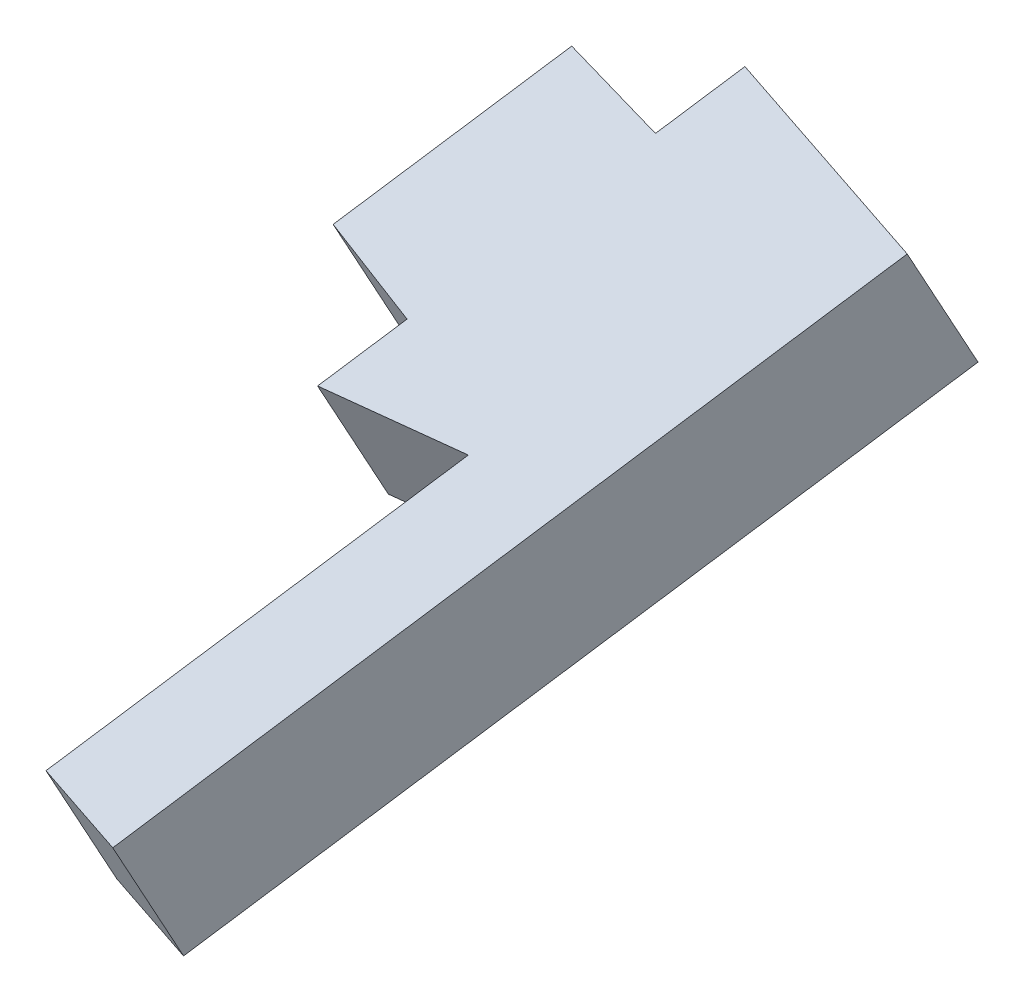
ISO-10303-21;
HEADER;
FILE_DESCRIPTION(('STEP AP214'),'2;1');
FILE_NAME('part.step','',(''),(''),'','','');
FILE_SCHEMA(('AUTOMOTIVE_DESIGN { 1 0 10303 214 1 1 1 1 }'));
ENDSEC;
DATA;
#1=APPLICATION_CONTEXT('core data for automotive mechanical design processes');
#2=APPLICATION_PROTOCOL_DEFINITION('international standard','automotive_design',2000,#1);
#3=PRODUCT_CONTEXT('',#1,'mechanical');
#4=PRODUCT('Part','Part','',(#3));
#5=PRODUCT_RELATED_PRODUCT_CATEGORY('part','',(#4));
#6=PRODUCT_DEFINITION_FORMATION('','',#4);
#7=PRODUCT_DEFINITION_CONTEXT('part definition',#1,'design');
#8=PRODUCT_DEFINITION('design','',#6,#7);
#9=PRODUCT_DEFINITION_SHAPE('','',#8);
#10=(LENGTH_UNIT() NAMED_UNIT(*) SI_UNIT(.MILLI.,.METRE.));
#11=(NAMED_UNIT(*) PLANE_ANGLE_UNIT() SI_UNIT($,.RADIAN.));
#12=(NAMED_UNIT(*) SI_UNIT($,.STERADIAN.) SOLID_ANGLE_UNIT());
#13=UNCERTAINTY_MEASURE_WITH_UNIT(LENGTH_MEASURE(1.E-05),#10,'distance_accuracy_value','');
#14=(GEOMETRIC_REPRESENTATION_CONTEXT(3) GLOBAL_UNCERTAINTY_ASSIGNED_CONTEXT((#13)) GLOBAL_UNIT_ASSIGNED_CONTEXT((#10,
#11,#12)) REPRESENTATION_CONTEXT('',''));
#15=CARTESIAN_POINT('',(0.,0.,0.));
#16=DIRECTION('',(0.,0.,1.));
#17=DIRECTION('',(1.,0.,0.));
#18=AXIS2_PLACEMENT_3D('',#15,#16,#17);
#19=CARTESIAN_POINT('',(-54.1127395750297,242.35256024136,-18.6749482944049));
#20=DIRECTION('',(0.315491799813361,0.448752869911152,-0.836113500666644));
#21=DIRECTION('',(0.,0.881113460327661,0.472904927051321));
#22=AXIS2_PLACEMENT_3D('',#19,#20,#21);
#23=PLANE('',#22);
#24=DIRECTION('',(0.938244346128408,-0.0156707955289249,0.345618247674462));
#25=VECTOR('',#24,1.);
#26=CARTESIAN_POINT('',(-53.2607718740517,236.991449314985,-21.2308513973387));
#27=LINE('',#26,#25);
#28=CARTESIAN_POINT('',(-53.2607718740517,236.991449314985,-21.2308513973387));
#29=VERTEX_POINT('',#28);
#30=CARTESIAN_POINT('',(-47.6278743883288,236.897367229547,-19.1558778934973));
#31=VERTEX_POINT('',#30);
#32=EDGE_CURVE('E152',#29,#31,#27,.T.);
#33=ORIENTED_EDGE('',*,*,#32,.T.);
#34=DIRECTION('',(0.141994616829656,-0.893518487729266,-0.425983850488964));
#35=VECTOR('',#34,1.);
#36=CARTESIAN_POINT('',(-48.4798420893067,242.258478155922,-16.5999747905635));
#37=LINE('',#36,#35);
#38=CARTESIAN_POINT('',(-48.4798420893067,242.258478155922,-16.5999747905635));
#39=VERTEX_POINT('',#38);
#40=EDGE_CURVE('E11',#39,#31,#37,.T.);
#41=ORIENTED_EDGE('',*,*,#40,.F.);
#42=DIRECTION('',(0.938244346128408,-0.0156707955289249,0.345618247674462));
#43=VECTOR('',#42,1.);
#44=CARTESIAN_POINT('',(-54.1127395750297,242.35256024136,-18.6749482944049));
#45=LINE('',#44,#43);
#46=CARTESIAN_POINT('',(-54.1127395750297,242.35256024136,-18.6749482944049));
#47=VERTEX_POINT('',#46);
#48=EDGE_CURVE('E180',#47,#39,#45,.T.);
#49=ORIENTED_EDGE('',*,*,#48,.F.);
#50=DIRECTION('',(0.141994616829656,-0.893518487729266,-0.425983850488964));
#51=VECTOR('',#50,1.);
#52=CARTESIAN_POINT('',(-54.1127395750297,242.35256024136,-18.6749482944049));
#53=LINE('',#52,#51);
#54=EDGE_CURVE('E148',#47,#29,#53,.T.);
#55=ORIENTED_EDGE('',*,*,#54,.T.);
#56=EDGE_LOOP('',(#33,#41,#49,#55));
#57=FACE_BOUND('',#56,.T.);
#58=ADVANCED_FACE('F39',(#57),#23,.F.);
#59=CARTESIAN_POINT('',(-48.4798420893067,242.258478155922,-16.5999747905635));
#60=DIRECTION('',(0.948683298050514,0.,0.316227766016837));
#61=DIRECTION('',(0.316227766016837,0.,-0.948683298050514));
#62=AXIS2_PLACEMENT_3D('',#59,#60,#61);
#63=PLANE('',#62);
#64=DIRECTION('',(-0.282555355269368,-0.449026404664587,0.847666065808108));
#65=VECTOR('',#64,1.);
#66=CARTESIAN_POINT('',(-47.6278743883288,236.897367229547,-19.1558778934973));
#67=LINE('',#66,#65);
#68=CARTESIAN_POINT('',(-48.704410291905,235.186576627775,-15.9262701827684));
#69=VERTEX_POINT('',#68);
#70=EDGE_CURVE('E156',#31,#69,#67,.T.);
#71=ORIENTED_EDGE('',*,*,#70,.T.);
#72=DIRECTION('',(0.141994616829656,-0.893518487729266,-0.425983850488964));
#73=VECTOR('',#72,1.);
#74=CARTESIAN_POINT('',(-49.556377992883,240.54768755415,-13.3703670798346));
#75=LINE('',#74,#73);
#76=CARTESIAN_POINT('',(-49.556377992883,240.54768755415,-13.3703670798346));
#77=VERTEX_POINT('',#76);
#78=EDGE_CURVE('E48',#77,#69,#75,.T.);
#79=ORIENTED_EDGE('',*,*,#78,.F.);
#80=DIRECTION('',(-0.282555355269368,-0.449026404664587,0.847666065808108));
#81=VECTOR('',#80,1.);
#82=CARTESIAN_POINT('',(-48.4798420893067,242.258478155922,-16.5999747905635));
#83=LINE('',#82,#81);
#84=EDGE_CURVE('E105',#39,#77,#83,.T.);
#85=ORIENTED_EDGE('',*,*,#84,.F.);
#86=ORIENTED_EDGE('',*,*,#40,.T.);
#87=EDGE_LOOP('',(#71,#79,#85,#86));
#88=FACE_BOUND('',#87,.T.);
#89=ADVANCED_FACE('F244',(#88),#63,.F.);
#90=CARTESIAN_POINT('',(-49.556377992883,240.54768755415,-13.3703670798346));
#91=DIRECTION('',(-0.0228322502363286,0.427273402730498,-0.903834126191442));
#92=DIRECTION('',(0.,0.904069807973402,0.427384817595263));
#93=AXIS2_PLACEMENT_3D('',#90,#91,#92);
#94=PLANE('',#93);
#95=DIRECTION('',(0.98960407089934,0.138065750297117,0.0402694853995987));
#96=VECTOR('',#95,1.);
#97=CARTESIAN_POINT('',(-48.704410291905,235.186576627775,-15.9262701827684));
#98=LINE('',#97,#96);
#99=CARTESIAN_POINT('',(-41.1437120551409,236.241416139379,-15.618606303638));
#100=VERTEX_POINT('',#99);
#101=EDGE_CURVE('E159',#69,#100,#98,.T.);
#102=ORIENTED_EDGE('',*,*,#101,.T.);
#103=DIRECTION('',(0.141994616829656,-0.893518487729266,-0.425983850488964));
#104=VECTOR('',#103,1.);
#105=CARTESIAN_POINT('',(-41.9956797561188,241.602527065754,-13.0627032007042));
#106=LINE('',#105,#104);
#107=CARTESIAN_POINT('',(-41.9956797561188,241.602527065754,-13.0627032007042));
#108=VERTEX_POINT('',#107);
#109=EDGE_CURVE('E199',#108,#100,#106,.T.);
#110=ORIENTED_EDGE('',*,*,#109,.F.);
#111=DIRECTION('',(0.98960407089934,0.138065750297117,0.0402694853995987));
#112=VECTOR('',#111,1.);
#113=CARTESIAN_POINT('',(-49.556377992883,240.54768755415,-13.3703670798346));
#114=LINE('',#113,#112);
#115=EDGE_CURVE('E209',#77,#108,#114,.T.);
#116=ORIENTED_EDGE('',*,*,#115,.F.);
#117=ORIENTED_EDGE('',*,*,#78,.T.);
#118=EDGE_LOOP('',(#102,#110,#116,#117));
#119=FACE_BOUND('',#118,.T.);
#120=ADVANCED_FACE('F207',(#119),#94,.F.);
#121=CARTESIAN_POINT('',(-41.9956797561188,241.602527065754,-13.0627032007042));
#122=DIRECTION('',(0.948683298050514,0.,0.316227766016837));
#123=DIRECTION('',(0.316227766016837,0.,-0.948683298050514));
#124=AXIS2_PLACEMENT_3D('',#121,#122,#123);
#125=PLANE('',#124);
#126=DIRECTION('',(-0.282555355269368,-0.449026404664587,0.847666065808108));
#127=VECTOR('',#126,1.);
#128=CARTESIAN_POINT('',(-41.1437120551409,236.241416139379,-15.618606303638));
#129=LINE('',#128,#127);
#130=CARTESIAN_POINT('',(-46.2250884035336,228.166282860481,-0.37447725845969));
#131=VERTEX_POINT('',#130);
#132=EDGE_CURVE('E162',#100,#131,#129,.T.);
#133=ORIENTED_EDGE('',*,*,#132,.T.);
#134=DIRECTION('',(0.141994616829656,-0.893518487729266,-0.425983850488964));
#135=VECTOR('',#134,1.);
#136=CARTESIAN_POINT('',(-47.0770561045115,233.527393786857,2.1814258444741));
#137=LINE('',#136,#135);
#138=CARTESIAN_POINT('',(-47.0770561045115,233.527393786857,2.1814258444741));
#139=VERTEX_POINT('',#138);
#140=EDGE_CURVE('E195',#139,#131,#137,.T.);
#141=ORIENTED_EDGE('',*,*,#140,.F.);
#142=DIRECTION('',(-0.282555355269368,-0.449026404664587,0.847666065808108));
#143=VECTOR('',#142,1.);
#144=CARTESIAN_POINT('',(-41.9956797561188,241.602527065754,-13.0627032007042));
#145=LINE('',#144,#143);
#146=EDGE_CURVE('E228',#108,#139,#145,.T.);
#147=ORIENTED_EDGE('',*,*,#146,.F.);
#148=ORIENTED_EDGE('',*,*,#109,.T.);
#149=EDGE_LOOP('',(#133,#141,#147,#148));
#150=FACE_BOUND('',#149,.T.);
#151=ADVANCED_FACE('F218',(#150),#125,.F.);
#152=CARTESIAN_POINT('',(-42.2577449504149,233.527393786857,3.78786289583963));
#153=DIRECTION('',(0.282555355269367,0.449026404664586,-0.847666065808109));
#154=DIRECTION('',(0.,0.88367494046767,0.468101057026642));
#155=AXIS2_PLACEMENT_3D('',#152,#153,#154);
#156=PLANE('',#155);
#157=DIRECTION('',(0.948683298050514,0.,0.316227766016838));
#158=VECTOR('',#157,1.);
#159=CARTESIAN_POINT('',(-41.405777249437,228.166282860481,1.23195979290585));
#160=LINE('',#159,#158);
#161=CARTESIAN_POINT('',(-41.405777249437,228.166282860481,1.23195979290585));
#162=VERTEX_POINT('',#161);
#163=EDGE_CURVE('E165',#131,#162,#160,.T.);
#164=ORIENTED_EDGE('',*,*,#163,.T.);
#165=DIRECTION('',(0.141994616829656,-0.893518487729266,-0.425983850488964));
#166=VECTOR('',#165,1.);
#167=CARTESIAN_POINT('',(-42.2577449504149,233.527393786857,3.78786289583963));
#168=LINE('',#167,#166);
#169=CARTESIAN_POINT('',(-42.2577449504149,233.527393786857,3.78786289583963));
#170=VERTEX_POINT('',#169);
#171=EDGE_CURVE('E191',#170,#162,#168,.T.);
#172=ORIENTED_EDGE('',*,*,#171,.F.);
#173=DIRECTION('',(0.948683298050514,0.,0.316227766016838));
#174=VECTOR('',#173,1.);
#175=CARTESIAN_POINT('',(-42.2577449504149,233.527393786857,3.78786289583963));
#176=LINE('',#175,#174);
#177=EDGE_CURVE('E224',#139,#170,#176,.T.);
#178=ORIENTED_EDGE('',*,*,#177,.F.);
#179=ORIENTED_EDGE('',*,*,#140,.T.);
#180=EDGE_LOOP('',(#164,#172,#178,#179));
#181=FACE_BOUND('',#180,.T.);
#182=ADVANCED_FACE('F222',(#181),#156,.F.);
#183=CARTESIAN_POINT('',(-32.6979004401099,248.719541199963,-24.8916706350757));
#184=DIRECTION('',(-0.948683298050514,0.,-0.316227766016837));
#185=DIRECTION('',(-0.316227766016837,0.,0.948683298050514));
#186=AXIS2_PLACEMENT_3D('',#183,#184,#185);
#187=PLANE('',#186);
#188=DIRECTION('',(0.282555355269368,0.449026404664587,-0.847666065808108));
#189=VECTOR('',#188,1.);
#190=CARTESIAN_POINT('',(-31.8459327391319,243.358430273587,-27.4475737380094));
#191=LINE('',#190,#189);
#192=CARTESIAN_POINT('',(-31.8459327391319,243.358430273587,-27.4475737380094));
#193=VERTEX_POINT('',#192);
#194=EDGE_CURVE('E168',#162,#193,#191,.T.);
#195=ORIENTED_EDGE('',*,*,#194,.T.);
#196=DIRECTION('',(0.141994616829656,-0.893518487729266,-0.425983850488964));
#197=VECTOR('',#196,1.);
#198=CARTESIAN_POINT('',(-32.6979004401099,248.719541199963,-24.8916706350757));
#199=LINE('',#198,#197);
#200=CARTESIAN_POINT('',(-32.6979004401099,248.719541199963,-24.8916706350757));
#201=VERTEX_POINT('',#200);
#202=EDGE_CURVE('E187',#201,#193,#199,.T.);
#203=ORIENTED_EDGE('',*,*,#202,.F.);
#204=DIRECTION('',(0.282555355269368,0.449026404664587,-0.847666065808108));
#205=VECTOR('',#204,1.);
#206=CARTESIAN_POINT('',(-32.6979004401099,248.719541199963,-24.8916706350757));
#207=LINE('',#206,#205);
#208=EDGE_CURVE('E227',#170,#201,#207,.T.);
#209=ORIENTED_EDGE('',*,*,#208,.F.);
#210=ORIENTED_EDGE('',*,*,#171,.T.);
#211=EDGE_LOOP('',(#195,#203,#209,#210));
#212=FACE_BOUND('',#211,.T.);
#213=ADVANCED_FACE('F256',(#212),#187,.F.);
#214=CARTESIAN_POINT('',(-44.4141391710334,248.719541199963,-28.7970835453835));
#215=DIRECTION('',(-0.282555355269369,-0.449026404664586,0.847666065808108));
#216=DIRECTION('',(0.,-0.88367494046767,-0.468101057026642));
#217=AXIS2_PLACEMENT_3D('',#214,#215,#216);
#218=PLANE('',#217);
#219=DIRECTION('',(-0.948683298050514,0.,-0.316227766016838));
#220=VECTOR('',#219,1.);
#221=CARTESIAN_POINT('',(-43.5621714700554,243.358430273587,-31.3529866483173));
#222=LINE('',#221,#220);
#223=CARTESIAN_POINT('',(-43.5621714700554,243.358430273587,-31.3529866483173));
#224=VERTEX_POINT('',#223);
#225=EDGE_CURVE('E171',#193,#224,#222,.T.);
#226=ORIENTED_EDGE('',*,*,#225,.T.);
#227=DIRECTION('',(0.141994616829656,-0.893518487729266,-0.425983850488964));
#228=VECTOR('',#227,1.);
#229=CARTESIAN_POINT('',(-44.4141391710334,248.719541199963,-28.7970835453835));
#230=LINE('',#229,#228);
#231=CARTESIAN_POINT('',(-44.4141391710334,248.719541199963,-28.7970835453835));
#232=VERTEX_POINT('',#231);
#233=EDGE_CURVE('E141',#232,#224,#230,.T.);
#234=ORIENTED_EDGE('',*,*,#233,.F.);
#235=DIRECTION('',(-0.948683298050514,0.,-0.316227766016838));
#236=VECTOR('',#235,1.);
#237=CARTESIAN_POINT('',(-44.4141391710334,248.719541199963,-28.7970835453835));
#238=LINE('',#237,#236);
#239=EDGE_CURVE('E130',#201,#232,#238,.T.);
#240=ORIENTED_EDGE('',*,*,#239,.F.);
#241=ORIENTED_EDGE('',*,*,#202,.T.);
#242=EDGE_LOOP('',(#226,#234,#240,#241));
#243=FACE_BOUND('',#242,.T.);
#244=ADVANCED_FACE('F259',(#243),#218,.F.);
#245=CARTESIAN_POINT('',(-45.4906750746097,247.00875059819,-25.5674758346546));
#246=DIRECTION('',(0.948683298050514,0.,0.316227766016836));
#247=DIRECTION('',(0.316227766016836,0.,-0.948683298050514));
#248=AXIS2_PLACEMENT_3D('',#245,#246,#247);
#249=PLANE('',#248);
#250=DIRECTION('',(-0.282555355269367,-0.449026404664585,0.847666065808109));
#251=VECTOR('',#250,1.);
#252=CARTESIAN_POINT('',(-44.6387073736317,241.647639671815,-28.1233789375884));
#253=LINE('',#252,#251);
#254=CARTESIAN_POINT('',(-44.6387073736317,241.647639671815,-28.1233789375884));
#255=VERTEX_POINT('',#254);
#256=EDGE_CURVE('E139',#224,#255,#253,.T.);
#257=ORIENTED_EDGE('',*,*,#256,.T.);
#258=DIRECTION('',(0.141994616829656,-0.893518487729266,-0.425983850488964));
#259=VECTOR('',#258,1.);
#260=CARTESIAN_POINT('',(-45.4906750746097,247.00875059819,-25.5674758346546));
#261=LINE('',#260,#259);
#262=CARTESIAN_POINT('',(-45.4906750746097,247.00875059819,-25.5674758346546));
#263=VERTEX_POINT('',#262);
#264=EDGE_CURVE('E136',#263,#255,#261,.T.);
#265=ORIENTED_EDGE('',*,*,#264,.F.);
#266=DIRECTION('',(-0.282555355269367,-0.449026404664585,0.847666065808109));
#267=VECTOR('',#266,1.);
#268=CARTESIAN_POINT('',(-45.4906750746097,247.00875059819,-25.5674758346546));
#269=LINE('',#268,#267);
#270=EDGE_CURVE('E124',#232,#263,#269,.T.);
#271=ORIENTED_EDGE('',*,*,#270,.F.);
#272=ORIENTED_EDGE('',*,*,#233,.T.);
#273=EDGE_LOOP('',(#257,#265,#271,#272));
#274=FACE_BOUND('',#273,.T.);
#275=ADVANCED_FACE('F137',(#274),#249,.F.);
#276=CARTESIAN_POINT('',(-51.2419771654929,246.914668512752,-27.2872355230153));
#277=DIRECTION('',(-0.249274660549299,-0.448752869911152,0.858185880421332));
#278=DIRECTION('',(0.,-0.886159426893028,-0.463380480953417));
#279=AXIS2_PLACEMENT_3D('',#276,#277,#278);
#280=PLANE('',#279);
#281=DIRECTION('',(-0.957966425507403,-0.0156707955289295,-0.286452009537479));
#282=VECTOR('',#281,1.);
#283=CARTESIAN_POINT('',(-50.3900094645149,241.553557586377,-29.8431386259491));
#284=LINE('',#283,#282);
#285=CARTESIAN_POINT('',(-50.3900094645149,241.553557586377,-29.8431386259491));
#286=VERTEX_POINT('',#285);
#287=EDGE_CURVE('E91',#255,#286,#284,.T.);
#288=ORIENTED_EDGE('',*,*,#287,.T.);
#289=DIRECTION('',(0.141994616829656,-0.893518487729266,-0.425983850488964));
#290=VECTOR('',#289,1.);
#291=CARTESIAN_POINT('',(-51.2419771654929,246.914668512752,-27.2872355230153));
#292=LINE('',#291,#290);
#293=CARTESIAN_POINT('',(-51.2419771654929,246.914668512752,-27.2872355230153));
#294=VERTEX_POINT('',#293);
#295=EDGE_CURVE('E142',#294,#286,#292,.T.);
#296=ORIENTED_EDGE('',*,*,#295,.F.);
#297=DIRECTION('',(-0.957966425507403,-0.0156707955289295,-0.286452009537479));
#298=VECTOR('',#297,1.);
#299=CARTESIAN_POINT('',(-51.2419771654929,246.914668512752,-27.2872355230153));
#300=LINE('',#299,#298);
#301=EDGE_CURVE('E128',#263,#294,#300,.T.);
#302=ORIENTED_EDGE('',*,*,#301,.F.);
#303=ORIENTED_EDGE('',*,*,#264,.T.);
#304=EDGE_LOOP('',(#288,#296,#302,#303));
#305=FACE_BOUND('',#304,.T.);
#306=ADVANCED_FACE('F144',(#305),#280,.F.);
#307=CARTESIAN_POINT('',(-54.1127395750297,242.35256024136,-18.6749482944049));
#308=DIRECTION('',(0.948683298050514,0.,0.316227766016837));
#309=DIRECTION('',(0.316227766016837,0.,-0.948683298050514));
#310=AXIS2_PLACEMENT_3D('',#307,#308,#309);
#311=PLANE('',#310);
#312=DIRECTION('',(-0.282555355269368,-0.449026404664586,0.847666065808109));
#313=VECTOR('',#312,1.);
#314=CARTESIAN_POINT('',(-53.2607718740517,236.991449314985,-21.2308513973387));
#315=LINE('',#314,#313);
#316=EDGE_CURVE('E97',#286,#29,#315,.T.);
#317=ORIENTED_EDGE('',*,*,#316,.T.);
#318=ORIENTED_EDGE('',*,*,#54,.F.);
#319=DIRECTION('',(-0.282555355269368,-0.449026404664586,0.847666065808109));
#320=VECTOR('',#319,1.);
#321=CARTESIAN_POINT('',(-54.1127395750297,242.35256024136,-18.6749482944049));
#322=LINE('',#321,#320);
#323=EDGE_CURVE('E56',#294,#47,#322,.T.);
#324=ORIENTED_EDGE('',*,*,#323,.F.);
#325=ORIENTED_EDGE('',*,*,#295,.T.);
#326=EDGE_LOOP('',(#317,#318,#324,#325));
#327=FACE_BOUND('',#326,.T.);
#328=ADVANCED_FACE('F268',(#327),#311,.F.);
#329=CARTESIAN_POINT('',(-30.7098835487494,193.245697051589,92.1296506462462));
#330=DIRECTION('',(0.141994616829658,-0.893518487729266,-0.425983850488964));
#331=DIRECTION('',(0.,0.430344344725871,-0.902664802106774));
#332=AXIS2_PLACEMENT_3D('',#329,#330,#331);
#333=PLANE('',#332);
#334=ORIENTED_EDGE('',*,*,#48,.T.);
#335=ORIENTED_EDGE('',*,*,#84,.T.);
#336=ORIENTED_EDGE('',*,*,#115,.T.);
#337=ORIENTED_EDGE('',*,*,#146,.T.);
#338=ORIENTED_EDGE('',*,*,#177,.T.);
#339=ORIENTED_EDGE('',*,*,#208,.T.);
#340=ORIENTED_EDGE('',*,*,#239,.T.);
#341=ORIENTED_EDGE('',*,*,#270,.T.);
#342=ORIENTED_EDGE('',*,*,#301,.T.);
#343=ORIENTED_EDGE('',*,*,#323,.T.);
#344=EDGE_LOOP('',(#334,#335,#336,#337,#338,#339,#340,#341,#342,#343));
#345=FACE_BOUND('',#344,.T.);
#346=ADVANCED_FACE('F126',(#345),#333,.F.);
#347=CARTESIAN_POINT('',(-29.8579158477715,187.884586125213,89.5737475433125));
#348=DIRECTION('',(0.141994616829658,-0.893518487729266,-0.425983850488964));
#349=DIRECTION('',(0.,0.430344344725871,-0.902664802106774));
#350=AXIS2_PLACEMENT_3D('',#347,#348,#349);
#351=PLANE('',#350);
#352=ORIENTED_EDGE('',*,*,#32,.F.);
#353=ORIENTED_EDGE('',*,*,#316,.F.);
#354=ORIENTED_EDGE('',*,*,#287,.F.);
#355=ORIENTED_EDGE('',*,*,#256,.F.);
#356=ORIENTED_EDGE('',*,*,#225,.F.);
#357=ORIENTED_EDGE('',*,*,#194,.F.);
#358=ORIENTED_EDGE('',*,*,#163,.F.);
#359=ORIENTED_EDGE('',*,*,#132,.F.);
#360=ORIENTED_EDGE('',*,*,#101,.F.);
#361=ORIENTED_EDGE('',*,*,#70,.F.);
#362=EDGE_LOOP('',(#352,#353,#354,#355,#356,#357,#358,#359,#360,#361));
#363=FACE_BOUND('',#362,.T.);
#364=ADVANCED_FACE('F213',(#363),#351,.T.);
#365=CLOSED_SHELL('',(#58,#89,#120,#151,#182,#213,#244,#275,#306,#328,#346,#364));
#366=MANIFOLD_SOLID_BREP('B2',#365);
#367=ADVANCED_BREP_SHAPE_REPRESENTATION('',(#18,#366),#14);
#368=SHAPE_DEFINITION_REPRESENTATION(#9,#367);
ENDSEC;
END-ISO-10303-21;
